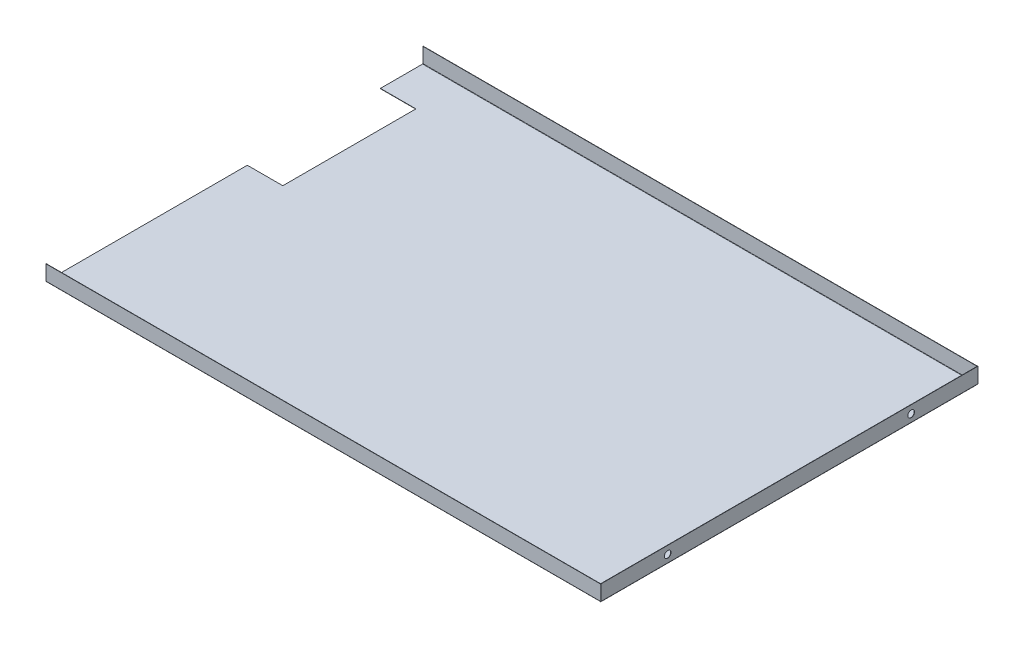
ISO-10303-21;
HEADER;
FILE_DESCRIPTION(('STEP AP214'),'2;1');
FILE_NAME('part.step','',(''),(''),'','','');
FILE_SCHEMA(('AUTOMOTIVE_DESIGN { 1 0 10303 214 1 1 1 1 }'));
ENDSEC;
DATA;
#1=APPLICATION_CONTEXT('core data for automotive mechanical design processes');
#2=APPLICATION_PROTOCOL_DEFINITION('international standard','automotive_design',2000,#1);
#3=PRODUCT_CONTEXT('',#1,'mechanical');
#4=PRODUCT('Part','Part','',(#3));
#5=PRODUCT_RELATED_PRODUCT_CATEGORY('part','',(#4));
#6=PRODUCT_DEFINITION_FORMATION('','',#4);
#7=PRODUCT_DEFINITION_CONTEXT('part definition',#1,'design');
#8=PRODUCT_DEFINITION('design','',#6,#7);
#9=PRODUCT_DEFINITION_SHAPE('','',#8);
#10=(LENGTH_UNIT() NAMED_UNIT(*) SI_UNIT(.MILLI.,.METRE.));
#11=(NAMED_UNIT(*) PLANE_ANGLE_UNIT() SI_UNIT($,.RADIAN.));
#12=(NAMED_UNIT(*) SI_UNIT($,.STERADIAN.) SOLID_ANGLE_UNIT());
#13=UNCERTAINTY_MEASURE_WITH_UNIT(LENGTH_MEASURE(1.E-05),#10,'distance_accuracy_value','');
#14=(GEOMETRIC_REPRESENTATION_CONTEXT(3) GLOBAL_UNCERTAINTY_ASSIGNED_CONTEXT((#13)) GLOBAL_UNIT_ASSIGNED_CONTEXT((#10,
#11,#12)) REPRESENTATION_CONTEXT('',''));
#15=CARTESIAN_POINT('',(0.,0.,0.));
#16=DIRECTION('',(0.,0.,1.));
#17=DIRECTION('',(1.,0.,0.));
#18=AXIS2_PLACEMENT_3D('',#15,#16,#17);
#19=CARTESIAN_POINT('',(0.,-0.127,170.));
#20=DIRECTION('',(-1.,0.,0.));
#21=DIRECTION('',(0.,0.,1.));
#22=AXIS2_PLACEMENT_3D('',#19,#20,#21);
#23=PLANE('',#22);
#24=DIRECTION('',(0.,-1.,0.));
#25=VECTOR('',#24,1.);
#26=CARTESIAN_POINT('',(0.,-0.127,19.254));
#27=LINE('',#26,#25);
#28=CARTESIAN_POINT('',(0.,0.,19.254));
#29=VERTEX_POINT('',#28);
#30=CARTESIAN_POINT('',(0.,-0.127,19.254));
#31=VERTEX_POINT('',#30);
#32=EDGE_CURVE('E84',#29,#31,#27,.T.);
#33=ORIENTED_EDGE('',*,*,#32,.F.);
#34=DIRECTION('',(0.,0.,-1.));
#35=VECTOR('',#34,1.);
#36=CARTESIAN_POINT('',(0.,0.,170.));
#37=LINE('',#36,#35);
#38=CARTESIAN_POINT('',(0.,0.,0.254));
#39=VERTEX_POINT('',#38);
#40=EDGE_CURVE('E257',#29,#39,#37,.T.);
#41=ORIENTED_EDGE('',*,*,#40,.T.);
#42=DIRECTION('',(0.,-1.,0.));
#43=VECTOR('',#42,1.);
#44=CARTESIAN_POINT('',(0.,0.,0.254));
#45=LINE('',#44,#43);
#46=CARTESIAN_POINT('',(0.,-0.127,0.254));
#47=VERTEX_POINT('',#46);
#48=EDGE_CURVE('E298',#39,#47,#45,.T.);
#49=ORIENTED_EDGE('',*,*,#48,.T.);
#50=DIRECTION('',(0.,0.,-1.));
#51=VECTOR('',#50,1.);
#52=CARTESIAN_POINT('',(0.,-0.127,170.));
#53=LINE('',#52,#51);
#54=EDGE_CURVE('E293',#31,#47,#53,.T.);
#55=ORIENTED_EDGE('',*,*,#54,.F.);
#56=EDGE_LOOP('',(#33,#41,#49,#55));
#57=FACE_BOUND('',#56,.T.);
#58=ADVANCED_FACE('F76',(#57),#23,.T.);
#59=CARTESIAN_POINT('',(249.873,0.,170.));
#60=DIRECTION('',(-1.,0.,0.));
#61=DIRECTION('',(0.,0.,1.));
#62=AXIS2_PLACEMENT_3D('',#59,#60,#61);
#63=PLANE('',#62);
#64=DIRECTION('',(0.,0.,-1.));
#65=VECTOR('',#64,1.);
#66=CARTESIAN_POINT('',(249.873,0.,170.));
#67=LINE('',#66,#65);
#68=CARTESIAN_POINT('',(249.873,0.,170.));
#69=VERTEX_POINT('',#68);
#70=CARTESIAN_POINT('',(249.873,0.,169.965970452561));
#71=VERTEX_POINT('',#70);
#72=EDGE_CURVE('E260',#69,#71,#67,.T.);
#73=ORIENTED_EDGE('',*,*,#72,.T.);
#74=CARTESIAN_POINT('',(249.873,0.126999999999988,169.746));
#75=DIRECTION('',(1.,0.,0.));
#76=DIRECTION('',(0.,0.,-1.));
#77=AXIS2_PLACEMENT_3D('',#74,#75,#76);
#78=CIRCLE('',#77,0.253999999999988);
#79=CARTESIAN_POINT('',(249.873,-0.127,169.746));
#80=VERTEX_POINT('',#79);
#81=EDGE_CURVE('E240',#71,#80,#78,.T.);
#82=ORIENTED_EDGE('',*,*,#81,.T.);
#83=DIRECTION('',(0.,0.,-1.));
#84=VECTOR('',#83,1.);
#85=CARTESIAN_POINT('',(249.873,-0.127,170.));
#86=LINE('',#85,#84);
#87=CARTESIAN_POINT('',(249.873,-0.127,170.));
#88=VERTEX_POINT('',#87);
#89=EDGE_CURVE('E300',#88,#80,#86,.T.);
#90=ORIENTED_EDGE('',*,*,#89,.F.);
#91=DIRECTION('',(0.,1.,0.));
#92=VECTOR('',#91,1.);
#93=CARTESIAN_POINT('',(249.873,-0.127,170.));
#94=LINE('',#93,#92);
#95=EDGE_CURVE('E276',#88,#69,#94,.T.);
#96=ORIENTED_EDGE('',*,*,#95,.T.);
#97=EDGE_LOOP('',(#73,#82,#90,#96));
#98=FACE_BOUND('',#97,.T.);
#99=ADVANCED_FACE('F507',(#98),#63,.T.);
#100=CARTESIAN_POINT('',(249.873,0.,0.254));
#101=DIRECTION('',(-1.,0.,0.));
#102=DIRECTION('',(0.,0.,1.));
#103=AXIS2_PLACEMENT_3D('',#100,#101,#102);
#104=PLANE('',#103);
#105=CARTESIAN_POINT('',(249.873,-0.127,0.254));
#106=VERTEX_POINT('',#105);
#107=CARTESIAN_POINT('',(249.873,-0.127,0.));
#108=VERTEX_POINT('',#107);
#109=EDGE_CURVE('E303',#106,#108,#86,.T.);
#110=ORIENTED_EDGE('',*,*,#109,.F.);
#111=CARTESIAN_POINT('',(249.873,0.126999999999999,0.254));
#112=DIRECTION('',(-1.,0.,0.));
#113=DIRECTION('',(0.,0.,1.));
#114=AXIS2_PLACEMENT_3D('',#111,#112,#113);
#115=CIRCLE('',#114,0.254);
#116=CARTESIAN_POINT('',(249.873,0.,0.0340295474387515));
#117=VERTEX_POINT('',#116);
#118=EDGE_CURVE('E353',#106,#117,#115,.F.);
#119=ORIENTED_EDGE('',*,*,#118,.T.);
#120=DIRECTION('',(0.,0.,-1.));
#121=VECTOR('',#120,1.);
#122=CARTESIAN_POINT('',(249.873,0.,0.254));
#123=LINE('',#122,#121);
#124=CARTESIAN_POINT('',(249.873,0.,0.));
#125=VERTEX_POINT('',#124);
#126=EDGE_CURVE('E351',#117,#125,#123,.T.);
#127=ORIENTED_EDGE('',*,*,#126,.T.);
#128=DIRECTION('',(0.,-1.,0.));
#129=VECTOR('',#128,1.);
#130=CARTESIAN_POINT('',(249.873,0.,0.));
#131=LINE('',#130,#129);
#132=EDGE_CURVE('E274',#125,#108,#131,.T.);
#133=ORIENTED_EDGE('',*,*,#132,.T.);
#134=EDGE_LOOP('',(#110,#119,#127,#133));
#135=FACE_BOUND('',#134,.T.);
#136=ADVANCED_FACE('F512',(#135),#104,.T.);
#137=CARTESIAN_POINT('',(0.,0.,170.));
#138=DIRECTION('',(0.,1.,0.));
#139=DIRECTION('',(0.,0.,1.));
#140=AXIS2_PLACEMENT_3D('',#137,#138,#139);
#141=PLANE('',#140);
#142=DIRECTION('',(-1.,0.,0.));
#143=VECTOR('',#142,1.);
#144=CARTESIAN_POINT('',(0.,0.,19.254));
#145=LINE('',#144,#143);
#146=CARTESIAN_POINT('',(16.,0.,19.254));
#147=VERTEX_POINT('',#146);
#148=EDGE_CURVE('E286',#147,#29,#145,.T.);
#149=ORIENTED_EDGE('',*,*,#148,.F.);
#150=DIRECTION('',(0.,0.,-1.));
#151=VECTOR('',#150,1.);
#152=CARTESIAN_POINT('',(16.,0.,19.254));
#153=LINE('',#152,#151);
#154=CARTESIAN_POINT('',(16.,0.,79.254));
#155=VERTEX_POINT('',#154);
#156=EDGE_CURVE('E250',#155,#147,#153,.T.);
#157=ORIENTED_EDGE('',*,*,#156,.F.);
#158=DIRECTION('',(1.,0.,0.));
#159=VECTOR('',#158,1.);
#160=CARTESIAN_POINT('',(16.,0.,79.254));
#161=LINE('',#160,#159);
#162=CARTESIAN_POINT('',(0.,0.,79.254));
#163=VERTEX_POINT('',#162);
#164=EDGE_CURVE('E234',#163,#155,#161,.T.);
#165=ORIENTED_EDGE('',*,*,#164,.F.);
#166=CARTESIAN_POINT('',(0.,0.,169.746));
#167=VERTEX_POINT('',#166);
#168=EDGE_CURVE('E247',#167,#163,#37,.T.);
#169=ORIENTED_EDGE('',*,*,#168,.F.);
#170=DIRECTION('',(1.,0.,0.));
#171=VECTOR('',#170,1.);
#172=CARTESIAN_POINT('',(249.873,0.,169.746));
#173=LINE('',#172,#171);
#174=CARTESIAN_POINT('',(249.873,0.,169.746));
#175=VERTEX_POINT('',#174);
#176=EDGE_CURVE('E407',#175,#167,#173,.F.);
#177=ORIENTED_EDGE('',*,*,#176,.F.);
#178=CARTESIAN_POINT('',(249.873,0.,0.254));
#179=VERTEX_POINT('',#178);
#180=EDGE_CURVE('E256',#175,#179,#67,.T.);
#181=ORIENTED_EDGE('',*,*,#180,.T.);
#182=DIRECTION('',(-1.,0.,0.));
#183=VECTOR('',#182,1.);
#184=CARTESIAN_POINT('',(0.,0.,0.254));
#185=LINE('',#184,#183);
#186=EDGE_CURVE('E357',#39,#179,#185,.F.);
#187=ORIENTED_EDGE('',*,*,#186,.F.);
#188=ORIENTED_EDGE('',*,*,#40,.F.);
#189=EDGE_LOOP('',(#149,#157,#165,#169,#177,#181,#187,#188));
#190=FACE_BOUND('',#189,.T.);
#191=ADVANCED_FACE('F245',(#190),#141,.T.);
#192=CARTESIAN_POINT('',(0.,-0.127,170.));
#193=DIRECTION('',(0.,1.,0.));
#194=DIRECTION('',(0.,0.,1.));
#195=AXIS2_PLACEMENT_3D('',#192,#193,#194);
#196=PLANE('',#195);
#197=DIRECTION('',(0.,0.,-1.));
#198=VECTOR('',#197,1.);
#199=CARTESIAN_POINT('',(16.,-0.127,170.));
#200=LINE('',#199,#198);
#201=CARTESIAN_POINT('',(16.,-0.127,79.254));
#202=VERTEX_POINT('',#201);
#203=CARTESIAN_POINT('',(16.,-0.127,19.254));
#204=VERTEX_POINT('',#203);
#205=EDGE_CURVE('E13',#202,#204,#200,.T.);
#206=ORIENTED_EDGE('',*,*,#205,.T.);
#207=DIRECTION('',(-1.,0.,0.));
#208=VECTOR('',#207,1.);
#209=CARTESIAN_POINT('',(0.,-0.127,19.254));
#210=LINE('',#209,#208);
#211=EDGE_CURVE('E284',#204,#31,#210,.T.);
#212=ORIENTED_EDGE('',*,*,#211,.T.);
#213=ORIENTED_EDGE('',*,*,#54,.T.);
#214=DIRECTION('',(-1.,0.,0.));
#215=VECTOR('',#214,1.);
#216=CARTESIAN_POINT('',(0.,-0.127000000000001,0.254));
#217=LINE('',#216,#215);
#218=EDGE_CURVE('E367',#47,#106,#217,.F.);
#219=ORIENTED_EDGE('',*,*,#218,.T.);
#220=EDGE_CURVE('E302',#80,#106,#86,.T.);
#221=ORIENTED_EDGE('',*,*,#220,.F.);
#222=DIRECTION('',(1.,0.,0.));
#223=VECTOR('',#222,1.);
#224=CARTESIAN_POINT('',(249.873,-0.127,169.746));
#225=LINE('',#224,#223);
#226=CARTESIAN_POINT('',(0.,-0.127,169.746));
#227=VERTEX_POINT('',#226);
#228=EDGE_CURVE('E416',#80,#227,#225,.F.);
#229=ORIENTED_EDGE('',*,*,#228,.T.);
#230=CARTESIAN_POINT('',(0.,-0.127,79.254));
#231=VERTEX_POINT('',#230);
#232=EDGE_CURVE('E261',#227,#231,#53,.T.);
#233=ORIENTED_EDGE('',*,*,#232,.T.);
#234=DIRECTION('',(1.,0.,0.));
#235=VECTOR('',#234,1.);
#236=CARTESIAN_POINT('',(0.,-0.127,79.254));
#237=LINE('',#236,#235);
#238=EDGE_CURVE('E91',#231,#202,#237,.T.);
#239=ORIENTED_EDGE('',*,*,#238,.T.);
#240=EDGE_LOOP('',(#206,#212,#213,#219,#221,#229,#233,#239));
#241=FACE_BOUND('',#240,.T.);
#242=ADVANCED_FACE('F291',(#241),#196,.F.);
#243=DIRECTION('',(0.,1.,0.));
#244=VECTOR('',#243,1.);
#245=CARTESIAN_POINT('',(0.,-0.127,79.254));
#246=LINE('',#245,#244);
#247=EDGE_CURVE('E231',#231,#163,#246,.T.);
#248=ORIENTED_EDGE('',*,*,#247,.F.);
#249=ORIENTED_EDGE('',*,*,#232,.F.);
#250=DIRECTION('',(0.,-1.,0.));
#251=VECTOR('',#250,1.);
#252=CARTESIAN_POINT('',(0.,0.,169.746));
#253=LINE('',#252,#251);
#254=EDGE_CURVE('E255',#167,#227,#253,.T.);
#255=ORIENTED_EDGE('',*,*,#254,.F.);
#256=ORIENTED_EDGE('',*,*,#168,.T.);
#257=EDGE_LOOP('',(#248,#249,#255,#256));
#258=FACE_BOUND('',#257,.T.);
#259=ADVANCED_FACE('F253',(#258),#23,.T.);
#260=CARTESIAN_POINT('',(250.,0.127,170.));
#261=DIRECTION('',(0.,0.,1.));
#262=DIRECTION('',(1.,0.,0.));
#263=AXIS2_PLACEMENT_3D('',#260,#261,#262);
#264=PLANE('',#263);
#265=DIRECTION('',(1.,0.,0.));
#266=VECTOR('',#265,1.);
#267=CARTESIAN_POINT('',(250.,0.127,170.));
#268=LINE('',#267,#266);
#269=CARTESIAN_POINT('',(250.,0.127,170.));
#270=VERTEX_POINT('',#269);
#271=CARTESIAN_POINT('',(250.127,0.127,170.));
#272=VERTEX_POINT('',#271);
#273=EDGE_CURVE('E279',#270,#272,#268,.T.);
#274=ORIENTED_EDGE('',*,*,#273,.F.);
#275=CARTESIAN_POINT('',(249.873,0.127,170.));
#276=DIRECTION('',(0.,0.,-1.));
#277=DIRECTION('',(-1.,0.,0.));
#278=AXIS2_PLACEMENT_3D('',#275,#276,#277);
#279=CIRCLE('',#278,0.127);
#280=EDGE_CURVE('E322',#69,#270,#279,.F.);
#281=ORIENTED_EDGE('',*,*,#280,.F.);
#282=ORIENTED_EDGE('',*,*,#95,.F.);
#283=CARTESIAN_POINT('',(249.873,0.127,170.));
#284=DIRECTION('',(0.,0.,1.));
#285=DIRECTION('',(1.,0.,0.));
#286=AXIS2_PLACEMENT_3D('',#283,#284,#285);
#287=CIRCLE('',#286,0.254);
#288=EDGE_CURVE('E315',#88,#272,#287,.T.);
#289=ORIENTED_EDGE('',*,*,#288,.T.);
#290=EDGE_LOOP('',(#274,#281,#282,#289));
#291=FACE_BOUND('',#290,.T.);
#292=ADVANCED_FACE('F78',(#291),#264,.T.);
#293=CARTESIAN_POINT('',(249.873,-0.127,170.));
#294=DIRECTION('',(0.,0.,1.));
#295=DIRECTION('',(1.,0.,0.));
#296=AXIS2_PLACEMENT_3D('',#293,#294,#295);
#297=PLANE('',#296);
#298=DIRECTION('',(0.,1.,0.));
#299=VECTOR('',#298,1.);
#300=CARTESIAN_POINT('',(250.,0.,170.));
#301=LINE('',#300,#299);
#302=CARTESIAN_POINT('',(250.,7.,170.));
#303=VERTEX_POINT('',#302);
#304=EDGE_CURVE('E342',#270,#303,#301,.T.);
#305=ORIENTED_EDGE('',*,*,#304,.F.);
#306=ORIENTED_EDGE('',*,*,#273,.T.);
#307=DIRECTION('',(0.,1.,0.));
#308=VECTOR('',#307,1.);
#309=CARTESIAN_POINT('',(250.127,0.,170.));
#310=LINE('',#309,#308);
#311=CARTESIAN_POINT('',(250.127,7.,170.));
#312=VERTEX_POINT('',#311);
#313=EDGE_CURVE('E327',#272,#312,#310,.T.);
#314=ORIENTED_EDGE('',*,*,#313,.T.);
#315=DIRECTION('',(1.,0.,0.));
#316=VECTOR('',#315,1.);
#317=CARTESIAN_POINT('',(250.,7.,170.));
#318=LINE('',#317,#316);
#319=EDGE_CURVE('E345',#303,#312,#318,.T.);
#320=ORIENTED_EDGE('',*,*,#319,.F.);
#321=EDGE_LOOP('',(#305,#306,#314,#320));
#322=FACE_BOUND('',#321,.T.);
#323=ADVANCED_FACE('F490',(#322),#297,.T.);
#324=CARTESIAN_POINT('',(249.873,0.,0.));
#325=DIRECTION('',(0.,0.,-1.));
#326=DIRECTION('',(-1.,0.,0.));
#327=AXIS2_PLACEMENT_3D('',#324,#325,#326);
#328=PLANE('',#327);
#329=ORIENTED_EDGE('',*,*,#132,.F.);
#330=CARTESIAN_POINT('',(249.873,0.127,0.));
#331=DIRECTION('',(0.,0.,-1.));
#332=DIRECTION('',(-1.,0.,0.));
#333=AXIS2_PLACEMENT_3D('',#330,#331,#332);
#334=CIRCLE('',#333,0.127);
#335=CARTESIAN_POINT('',(250.,0.127,0.));
#336=VERTEX_POINT('',#335);
#337=EDGE_CURVE('E328',#125,#336,#334,.F.);
#338=ORIENTED_EDGE('',*,*,#337,.T.);
#339=DIRECTION('',(-1.,0.,0.));
#340=VECTOR('',#339,1.);
#341=CARTESIAN_POINT('',(250.127,0.127,0.));
#342=LINE('',#341,#340);
#343=CARTESIAN_POINT('',(250.127,0.127,0.));
#344=VERTEX_POINT('',#343);
#345=EDGE_CURVE('E272',#344,#336,#342,.T.);
#346=ORIENTED_EDGE('',*,*,#345,.F.);
#347=CARTESIAN_POINT('',(249.873,0.127,0.));
#348=DIRECTION('',(0.,0.,1.));
#349=DIRECTION('',(1.,0.,0.));
#350=AXIS2_PLACEMENT_3D('',#347,#348,#349);
#351=CIRCLE('',#350,0.254);
#352=EDGE_CURVE('E325',#108,#344,#351,.T.);
#353=ORIENTED_EDGE('',*,*,#352,.F.);
#354=EDGE_LOOP('',(#329,#338,#346,#353));
#355=FACE_BOUND('',#354,.T.);
#356=ADVANCED_FACE('F486',(#355),#328,.T.);
#357=CARTESIAN_POINT('',(250.127,0.,170.));
#358=DIRECTION('',(-1.,0.,0.));
#359=DIRECTION('',(0.,0.,1.));
#360=AXIS2_PLACEMENT_3D('',#357,#358,#359);
#361=PLANE('',#360);
#362=CARTESIAN_POINT('',(250.127,3.45117189676535,139.873));
#363=DIRECTION('',(-1.,0.,0.));
#364=DIRECTION('',(0.,0.,1.));
#365=AXIS2_PLACEMENT_3D('',#362,#363,#364);
#366=CIRCLE('',#365,1.5);
#367=CARTESIAN_POINT('',(250.127,3.45117189676535,141.373));
#368=VERTEX_POINT('',#367);
#369=EDGE_CURVE('E460',#368,#368,#366,.T.);
#370=ORIENTED_EDGE('',*,*,#369,.T.);
#371=EDGE_LOOP('',(#370));
#372=FACE_BOUND('',#371,.T.);
#373=CARTESIAN_POINT('',(250.127,3.45117189676535,30.127));
#374=DIRECTION('',(-1.,0.,0.));
#375=DIRECTION('',(0.,0.,1.));
#376=AXIS2_PLACEMENT_3D('',#373,#374,#375);
#377=CIRCLE('',#376,1.5);
#378=CARTESIAN_POINT('',(250.127,3.45117189676535,31.627));
#379=VERTEX_POINT('',#378);
#380=EDGE_CURVE('E251',#379,#379,#377,.T.);
#381=ORIENTED_EDGE('',*,*,#380,.T.);
#382=EDGE_LOOP('',(#381));
#383=FACE_BOUND('',#382,.T.);
#384=DIRECTION('',(0.,1.,0.));
#385=VECTOR('',#384,1.);
#386=CARTESIAN_POINT('',(250.127,0.,0.));
#387=LINE('',#386,#385);
#388=CARTESIAN_POINT('',(250.127,7.,0.));
#389=VERTEX_POINT('',#388);
#390=EDGE_CURVE('E337',#344,#389,#387,.T.);
#391=ORIENTED_EDGE('',*,*,#390,.T.);
#392=DIRECTION('',(0.,0.,-1.));
#393=VECTOR('',#392,1.);
#394=CARTESIAN_POINT('',(250.127,7.,170.));
#395=LINE('',#394,#393);
#396=EDGE_CURVE('E270',#312,#389,#395,.T.);
#397=ORIENTED_EDGE('',*,*,#396,.F.);
#398=ORIENTED_EDGE('',*,*,#313,.F.);
#399=DIRECTION('',(0.,0.,-1.));
#400=VECTOR('',#399,1.);
#401=CARTESIAN_POINT('',(250.127,0.127,170.));
#402=LINE('',#401,#400);
#403=EDGE_CURVE('E310',#272,#344,#402,.T.);
#404=ORIENTED_EDGE('',*,*,#403,.T.);
#405=EDGE_LOOP('',(#391,#397,#398,#404));
#406=FACE_BOUND('',#405,.T.);
#407=ADVANCED_FACE('F495',(#372,#383,#406),#361,.F.);
#408=CARTESIAN_POINT('',(250.,7.,170.));
#409=DIRECTION('',(0.,1.,0.));
#410=DIRECTION('',(0.,0.,1.));
#411=AXIS2_PLACEMENT_3D('',#408,#409,#410);
#412=PLANE('',#411);
#413=DIRECTION('',(1.,0.,0.));
#414=VECTOR('',#413,1.);
#415=CARTESIAN_POINT('',(250.,7.,0.));
#416=LINE('',#415,#414);
#417=CARTESIAN_POINT('',(250.,7.,0.));
#418=VERTEX_POINT('',#417);
#419=EDGE_CURVE('E334',#418,#389,#416,.T.);
#420=ORIENTED_EDGE('',*,*,#419,.F.);
#421=DIRECTION('',(0.,0.,-1.));
#422=VECTOR('',#421,1.);
#423=CARTESIAN_POINT('',(250.,7.,170.));
#424=LINE('',#423,#422);
#425=EDGE_CURVE('E268',#303,#418,#424,.T.);
#426=ORIENTED_EDGE('',*,*,#425,.F.);
#427=ORIENTED_EDGE('',*,*,#319,.T.);
#428=ORIENTED_EDGE('',*,*,#396,.T.);
#429=EDGE_LOOP('',(#420,#426,#427,#428));
#430=FACE_BOUND('',#429,.T.);
#431=ADVANCED_FACE('F474',(#430),#412,.T.);
#432=CARTESIAN_POINT('',(250.,0.,170.));
#433=DIRECTION('',(-1.,0.,0.));
#434=DIRECTION('',(0.,0.,1.));
#435=AXIS2_PLACEMENT_3D('',#432,#433,#434);
#436=PLANE('',#435);
#437=CARTESIAN_POINT('',(250.,3.45117189676535,139.873));
#438=DIRECTION('',(-1.,0.,0.));
#439=DIRECTION('',(0.,0.,1.));
#440=AXIS2_PLACEMENT_3D('',#437,#438,#439);
#441=CIRCLE('',#440,1.5);
#442=CARTESIAN_POINT('',(250.,3.45117189676535,141.373));
#443=VERTEX_POINT('',#442);
#444=EDGE_CURVE('E463',#443,#443,#441,.T.);
#445=ORIENTED_EDGE('',*,*,#444,.F.);
#446=EDGE_LOOP('',(#445));
#447=FACE_BOUND('',#446,.T.);
#448=CARTESIAN_POINT('',(250.,3.45117189676535,30.127));
#449=DIRECTION('',(-1.,0.,0.));
#450=DIRECTION('',(0.,0.,1.));
#451=AXIS2_PLACEMENT_3D('',#448,#449,#450);
#452=CIRCLE('',#451,1.5);
#453=CARTESIAN_POINT('',(250.,3.45117189676535,31.627));
#454=VERTEX_POINT('',#453);
#455=EDGE_CURVE('E457',#454,#454,#452,.T.);
#456=ORIENTED_EDGE('',*,*,#455,.F.);
#457=EDGE_LOOP('',(#456));
#458=FACE_BOUND('',#457,.T.);
#459=DIRECTION('',(0.,1.,0.));
#460=VECTOR('',#459,1.);
#461=CARTESIAN_POINT('',(250.,0.,0.));
#462=LINE('',#461,#460);
#463=EDGE_CURVE('E331',#336,#418,#462,.T.);
#464=ORIENTED_EDGE('',*,*,#463,.F.);
#465=DIRECTION('',(0.,0.,-1.));
#466=VECTOR('',#465,1.);
#467=CARTESIAN_POINT('',(250.,0.127,170.));
#468=LINE('',#467,#466);
#469=EDGE_CURVE('E265',#270,#336,#468,.T.);
#470=ORIENTED_EDGE('',*,*,#469,.F.);
#471=ORIENTED_EDGE('',*,*,#304,.T.);
#472=ORIENTED_EDGE('',*,*,#425,.T.);
#473=EDGE_LOOP('',(#464,#470,#471,#472));
#474=FACE_BOUND('',#473,.T.);
#475=ADVANCED_FACE('F470',(#447,#458,#474),#436,.T.);
#476=CARTESIAN_POINT('',(249.873,0.127,170.));
#477=DIRECTION('',(0.,0.,-1.));
#478=DIRECTION('',(-1.,0.,0.));
#479=AXIS2_PLACEMENT_3D('',#476,#477,#478);
#480=CYLINDRICAL_SURFACE('',#479,0.127);
#481=ORIENTED_EDGE('',*,*,#337,.F.);
#482=ORIENTED_EDGE('',*,*,#126,.F.);
#483=EDGE_CURVE('E338',#179,#117,#123,.T.);
#484=ORIENTED_EDGE('',*,*,#483,.F.);
#485=ORIENTED_EDGE('',*,*,#180,.F.);
#486=EDGE_CURVE('E99',#71,#175,#67,.T.);
#487=ORIENTED_EDGE('',*,*,#486,.F.);
#488=ORIENTED_EDGE('',*,*,#72,.F.);
#489=ORIENTED_EDGE('',*,*,#280,.T.);
#490=ORIENTED_EDGE('',*,*,#469,.T.);
#491=EDGE_LOOP('',(#481,#482,#484,#485,#487,#488,#489,#490));
#492=FACE_BOUND('',#491,.T.);
#493=ADVANCED_FACE('F473',(#492),#480,.F.);
#494=CARTESIAN_POINT('',(249.873,0.127,170.));
#495=DIRECTION('',(0.,0.,-1.));
#496=DIRECTION('',(-1.,0.,0.));
#497=AXIS2_PLACEMENT_3D('',#494,#495,#496);
#498=CYLINDRICAL_SURFACE('',#497,0.254);
#499=ORIENTED_EDGE('',*,*,#352,.T.);
#500=ORIENTED_EDGE('',*,*,#403,.F.);
#501=ORIENTED_EDGE('',*,*,#288,.F.);
#502=ORIENTED_EDGE('',*,*,#89,.T.);
#503=ORIENTED_EDGE('',*,*,#220,.T.);
#504=ORIENTED_EDGE('',*,*,#109,.T.);
#505=EDGE_LOOP('',(#499,#500,#501,#502,#503,#504));
#506=FACE_BOUND('',#505,.T.);
#507=ADVANCED_FACE('F526',(#506),#498,.T.);
#508=CARTESIAN_POINT('',(249.873,0.127,0.));
#509=DIRECTION('',(0.,0.,-1.));
#510=DIRECTION('',(-1.,0.,0.));
#511=AXIS2_PLACEMENT_3D('',#508,#509,#510);
#512=PLANE('',#511);
#513=ORIENTED_EDGE('',*,*,#390,.F.);
#514=ORIENTED_EDGE('',*,*,#345,.T.);
#515=ORIENTED_EDGE('',*,*,#463,.T.);
#516=ORIENTED_EDGE('',*,*,#419,.T.);
#517=EDGE_LOOP('',(#513,#514,#515,#516));
#518=FACE_BOUND('',#517,.T.);
#519=ADVANCED_FACE('F494',(#518),#512,.T.);
#520=CARTESIAN_POINT('',(249.873,0.126999999999999,0.254));
#521=DIRECTION('',(1.,0.,0.));
#522=DIRECTION('',(0.,0.,-1.));
#523=AXIS2_PLACEMENT_3D('',#520,#521,#522);
#524=PLANE('',#523);
#525=CARTESIAN_POINT('',(249.873,0.126999999999999,0.254));
#526=DIRECTION('',(-1.,0.,0.));
#527=DIRECTION('',(0.,0.,1.));
#528=AXIS2_PLACEMENT_3D('',#525,#526,#527);
#529=CIRCLE('',#528,0.127);
#530=CARTESIAN_POINT('',(249.873,0.126999999999998,0.127));
#531=VERTEX_POINT('',#530);
#532=EDGE_CURVE('E361',#179,#531,#529,.F.);
#533=ORIENTED_EDGE('',*,*,#532,.F.);
#534=ORIENTED_EDGE('',*,*,#483,.T.);
#535=CARTESIAN_POINT('',(249.873,0.126999999999998,0.));
#536=VERTEX_POINT('',#535);
#537=EDGE_CURVE('E370',#117,#536,#115,.F.);
#538=ORIENTED_EDGE('',*,*,#537,.T.);
#539=DIRECTION('',(0.,0.,1.));
#540=VECTOR('',#539,1.);
#541=CARTESIAN_POINT('',(249.873,0.127,0.));
#542=LINE('',#541,#540);
#543=EDGE_CURVE('E372',#531,#536,#542,.F.);
#544=ORIENTED_EDGE('',*,*,#543,.F.);
#545=EDGE_LOOP('',(#533,#534,#538,#544));
#546=FACE_BOUND('',#545,.T.);
#547=ADVANCED_FACE('F531',(#546),#524,.T.);
#548=CARTESIAN_POINT('',(0.,0.126999999999999,0.254));
#549=DIRECTION('',(1.,0.,0.));
#550=DIRECTION('',(0.,0.,-1.));
#551=AXIS2_PLACEMENT_3D('',#548,#549,#550);
#552=PLANE('',#551);
#553=CARTESIAN_POINT('',(0.,0.126999999999999,0.254));
#554=DIRECTION('',(-1.,0.,0.));
#555=DIRECTION('',(0.,0.,1.));
#556=AXIS2_PLACEMENT_3D('',#553,#554,#555);
#557=CIRCLE('',#556,0.127);
#558=CARTESIAN_POINT('',(0.,0.126999999999998,0.127));
#559=VERTEX_POINT('',#558);
#560=EDGE_CURVE('E354',#559,#39,#557,.T.);
#561=ORIENTED_EDGE('',*,*,#560,.F.);
#562=DIRECTION('',(0.,0.,1.));
#563=VECTOR('',#562,1.);
#564=CARTESIAN_POINT('',(0.,0.127,0.127));
#565=LINE('',#564,#563);
#566=CARTESIAN_POINT('',(0.,0.127,0.));
#567=VERTEX_POINT('',#566);
#568=EDGE_CURVE('E377',#559,#567,#565,.F.);
#569=ORIENTED_EDGE('',*,*,#568,.T.);
#570=CARTESIAN_POINT('',(0.,0.126999999999999,0.254));
#571=DIRECTION('',(-1.,0.,0.));
#572=DIRECTION('',(0.,0.,1.));
#573=AXIS2_PLACEMENT_3D('',#570,#571,#572);
#574=CIRCLE('',#573,0.254);
#575=EDGE_CURVE('E364',#567,#47,#574,.T.);
#576=ORIENTED_EDGE('',*,*,#575,.T.);
#577=ORIENTED_EDGE('',*,*,#48,.F.);
#578=EDGE_LOOP('',(#561,#569,#576,#577));
#579=FACE_BOUND('',#578,.T.);
#580=ADVANCED_FACE('F535',(#579),#552,.F.);
#581=CARTESIAN_POINT('',(0.,0.126999999999999,0.254));
#582=DIRECTION('',(-1.,0.,0.));
#583=DIRECTION('',(0.,0.,-1.));
#584=AXIS2_PLACEMENT_3D('',#581,#582,#583);
#585=CYLINDRICAL_SURFACE('',#584,0.254);
#586=ORIENTED_EDGE('',*,*,#218,.F.);
#587=ORIENTED_EDGE('',*,*,#575,.F.);
#588=DIRECTION('',(-1.,0.,0.));
#589=VECTOR('',#588,1.);
#590=CARTESIAN_POINT('',(249.873,0.127,0.));
#591=LINE('',#590,#589);
#592=EDGE_CURVE('E380',#567,#536,#591,.F.);
#593=ORIENTED_EDGE('',*,*,#592,.T.);
#594=ORIENTED_EDGE('',*,*,#537,.F.);
#595=ORIENTED_EDGE('',*,*,#118,.F.);
#596=EDGE_LOOP('',(#586,#587,#593,#594,#595));
#597=FACE_BOUND('',#596,.T.);
#598=ADVANCED_FACE('F538',(#597),#585,.T.);
#599=CARTESIAN_POINT('',(0.,0.126999999999999,0.254));
#600=DIRECTION('',(-1.,0.,0.));
#601=DIRECTION('',(0.,0.,-1.));
#602=AXIS2_PLACEMENT_3D('',#599,#600,#601);
#603=CYLINDRICAL_SURFACE('',#602,0.127);
#604=ORIENTED_EDGE('',*,*,#186,.T.);
#605=ORIENTED_EDGE('',*,*,#532,.T.);
#606=DIRECTION('',(-1.,0.,0.));
#607=VECTOR('',#606,1.);
#608=CARTESIAN_POINT('',(249.873,0.127,0.127));
#609=LINE('',#608,#607);
#610=EDGE_CURVE('E375',#531,#559,#609,.T.);
#611=ORIENTED_EDGE('',*,*,#610,.T.);
#612=ORIENTED_EDGE('',*,*,#560,.T.);
#613=EDGE_LOOP('',(#604,#605,#611,#612));
#614=FACE_BOUND('',#613,.T.);
#615=ADVANCED_FACE('F543',(#614),#603,.F.);
#616=CARTESIAN_POINT('',(0.,6.873,0.));
#617=DIRECTION('',(1.,0.,0.));
#618=DIRECTION('',(0.,0.,-1.));
#619=AXIS2_PLACEMENT_3D('',#616,#617,#618);
#620=PLANE('',#619);
#621=ORIENTED_EDGE('',*,*,#568,.F.);
#622=DIRECTION('',(0.,-1.,0.));
#623=VECTOR('',#622,1.);
#624=CARTESIAN_POINT('',(0.,6.873,0.126999999999976));
#625=LINE('',#624,#623);
#626=CARTESIAN_POINT('',(0.,6.873,0.126999999999976));
#627=VERTEX_POINT('',#626);
#628=EDGE_CURVE('E383',#559,#627,#625,.F.);
#629=ORIENTED_EDGE('',*,*,#628,.T.);
#630=DIRECTION('',(0.,0.,1.));
#631=VECTOR('',#630,1.);
#632=CARTESIAN_POINT('',(0.,6.873,0.));
#633=LINE('',#632,#631);
#634=CARTESIAN_POINT('',(0.,6.873,0.));
#635=VERTEX_POINT('',#634);
#636=EDGE_CURVE('E358',#635,#627,#633,.T.);
#637=ORIENTED_EDGE('',*,*,#636,.F.);
#638=DIRECTION('',(0.,1.,0.));
#639=VECTOR('',#638,1.);
#640=CARTESIAN_POINT('',(0.,0.,0.));
#641=LINE('',#640,#639);
#642=EDGE_CURVE('E390',#567,#635,#641,.T.);
#643=ORIENTED_EDGE('',*,*,#642,.F.);
#644=EDGE_LOOP('',(#621,#629,#637,#643));
#645=FACE_BOUND('',#644,.T.);
#646=ADVANCED_FACE('F546',(#645),#620,.F.);
#647=CARTESIAN_POINT('',(249.873,0.,0.));
#648=DIRECTION('',(-1.,0.,0.));
#649=DIRECTION('',(0.,0.,1.));
#650=AXIS2_PLACEMENT_3D('',#647,#648,#649);
#651=PLANE('',#650);
#652=ORIENTED_EDGE('',*,*,#543,.T.);
#653=DIRECTION('',(0.,-1.,0.));
#654=VECTOR('',#653,1.);
#655=CARTESIAN_POINT('',(249.873,0.,0.));
#656=LINE('',#655,#654);
#657=CARTESIAN_POINT('',(249.873,6.873,0.));
#658=VERTEX_POINT('',#657);
#659=EDGE_CURVE('E394',#658,#536,#656,.T.);
#660=ORIENTED_EDGE('',*,*,#659,.F.);
#661=DIRECTION('',(0.,0.,1.));
#662=VECTOR('',#661,1.);
#663=CARTESIAN_POINT('',(249.873,6.873,0.));
#664=LINE('',#663,#662);
#665=CARTESIAN_POINT('',(249.873,6.873,0.126999999999976));
#666=VERTEX_POINT('',#665);
#667=EDGE_CURVE('E397',#658,#666,#664,.T.);
#668=ORIENTED_EDGE('',*,*,#667,.T.);
#669=DIRECTION('',(0.,1.,0.));
#670=VECTOR('',#669,1.);
#671=CARTESIAN_POINT('',(249.873,0.,0.127));
#672=LINE('',#671,#670);
#673=EDGE_CURVE('E387',#666,#531,#672,.F.);
#674=ORIENTED_EDGE('',*,*,#673,.T.);
#675=EDGE_LOOP('',(#652,#660,#668,#674));
#676=FACE_BOUND('',#675,.T.);
#677=ADVANCED_FACE('F553',(#676),#651,.F.);
#678=CARTESIAN_POINT('',(0.,0.,0.));
#679=DIRECTION('',(0.,0.,1.));
#680=DIRECTION('',(0.,-1.,0.));
#681=AXIS2_PLACEMENT_3D('',#678,#679,#680);
#682=PLANE('',#681);
#683=ORIENTED_EDGE('',*,*,#592,.F.);
#684=ORIENTED_EDGE('',*,*,#642,.T.);
#685=DIRECTION('',(1.,0.,0.));
#686=VECTOR('',#685,1.);
#687=CARTESIAN_POINT('',(0.,6.873,0.));
#688=LINE('',#687,#686);
#689=EDGE_CURVE('E392',#635,#658,#688,.T.);
#690=ORIENTED_EDGE('',*,*,#689,.T.);
#691=ORIENTED_EDGE('',*,*,#659,.T.);
#692=EDGE_LOOP('',(#683,#684,#690,#691));
#693=FACE_BOUND('',#692,.T.);
#694=ADVANCED_FACE('F563',(#693),#682,.F.);
#695=CARTESIAN_POINT('',(0.,0.,0.127));
#696=DIRECTION('',(0.,0.,1.));
#697=DIRECTION('',(0.,-1.,0.));
#698=AXIS2_PLACEMENT_3D('',#695,#696,#697);
#699=PLANE('',#698);
#700=ORIENTED_EDGE('',*,*,#628,.F.);
#701=ORIENTED_EDGE('',*,*,#610,.F.);
#702=ORIENTED_EDGE('',*,*,#673,.F.);
#703=DIRECTION('',(-1.,0.,0.));
#704=VECTOR('',#703,1.);
#705=CARTESIAN_POINT('',(249.873,6.873,0.126999999999976));
#706=LINE('',#705,#704);
#707=EDGE_CURVE('E385',#627,#666,#706,.F.);
#708=ORIENTED_EDGE('',*,*,#707,.F.);
#709=EDGE_LOOP('',(#700,#701,#702,#708));
#710=FACE_BOUND('',#709,.T.);
#711=ADVANCED_FACE('F559',(#710),#699,.T.);
#712=CARTESIAN_POINT('',(249.873,6.873,0.));
#713=DIRECTION('',(0.,-1.,0.));
#714=DIRECTION('',(0.,0.,-1.));
#715=AXIS2_PLACEMENT_3D('',#712,#713,#714);
#716=PLANE('',#715);
#717=ORIENTED_EDGE('',*,*,#707,.T.);
#718=ORIENTED_EDGE('',*,*,#667,.F.);
#719=ORIENTED_EDGE('',*,*,#689,.F.);
#720=ORIENTED_EDGE('',*,*,#636,.T.);
#721=EDGE_LOOP('',(#717,#718,#719,#720));
#722=FACE_BOUND('',#721,.T.);
#723=ADVANCED_FACE('F555',(#722),#716,.F.);
#724=CARTESIAN_POINT('',(0.,0.126999999999988,169.746));
#725=DIRECTION('',(-1.,0.,0.));
#726=DIRECTION('',(0.,0.,1.));
#727=AXIS2_PLACEMENT_3D('',#724,#725,#726);
#728=PLANE('',#727);
#729=DIRECTION('',(0.,0.,-1.));
#730=VECTOR('',#729,1.);
#731=CARTESIAN_POINT('',(0.,0.126999999999988,170.));
#732=LINE('',#731,#730);
#733=CARTESIAN_POINT('',(0.,0.126999999999988,169.873));
#734=VERTEX_POINT('',#733);
#735=CARTESIAN_POINT('',(0.,0.126999999999988,170.));
#736=VERTEX_POINT('',#735);
#737=EDGE_CURVE('E295',#734,#736,#732,.F.);
#738=ORIENTED_EDGE('',*,*,#737,.F.);
#739=CARTESIAN_POINT('',(0.,0.126999999999988,169.746));
#740=DIRECTION('',(1.,0.,0.));
#741=DIRECTION('',(0.,0.,-1.));
#742=AXIS2_PLACEMENT_3D('',#739,#740,#741);
#743=CIRCLE('',#742,0.126999999999988);
#744=EDGE_CURVE('E410',#167,#734,#743,.F.);
#745=ORIENTED_EDGE('',*,*,#744,.F.);
#746=ORIENTED_EDGE('',*,*,#254,.T.);
#747=CARTESIAN_POINT('',(0.,0.126999999999988,169.746));
#748=DIRECTION('',(1.,0.,0.));
#749=DIRECTION('',(0.,0.,-1.));
#750=AXIS2_PLACEMENT_3D('',#747,#748,#749);
#751=CIRCLE('',#750,0.253999999999988);
#752=EDGE_CURVE('E403',#227,#736,#751,.F.);
#753=ORIENTED_EDGE('',*,*,#752,.T.);
#754=EDGE_LOOP('',(#738,#745,#746,#753));
#755=FACE_BOUND('',#754,.T.);
#756=ADVANCED_FACE('F558',(#755),#728,.T.);
#757=CARTESIAN_POINT('',(249.873,0.126999999999988,169.746));
#758=DIRECTION('',(-1.,0.,0.));
#759=DIRECTION('',(0.,0.,1.));
#760=AXIS2_PLACEMENT_3D('',#757,#758,#759);
#761=PLANE('',#760);
#762=CARTESIAN_POINT('',(249.873,0.126999999999988,170.));
#763=VERTEX_POINT('',#762);
#764=EDGE_CURVE('E413',#763,#71,#78,.T.);
#765=ORIENTED_EDGE('',*,*,#764,.T.);
#766=ORIENTED_EDGE('',*,*,#486,.T.);
#767=CARTESIAN_POINT('',(249.873,0.126999999999988,169.746));
#768=DIRECTION('',(1.,0.,0.));
#769=DIRECTION('',(0.,0.,-1.));
#770=AXIS2_PLACEMENT_3D('',#767,#768,#769);
#771=CIRCLE('',#770,0.126999999999988);
#772=CARTESIAN_POINT('',(249.873,0.126999999999988,169.873));
#773=VERTEX_POINT('',#772);
#774=EDGE_CURVE('E404',#773,#175,#771,.T.);
#775=ORIENTED_EDGE('',*,*,#774,.F.);
#776=DIRECTION('',(0.,0.,-1.));
#777=VECTOR('',#776,1.);
#778=CARTESIAN_POINT('',(249.873,0.126999999999988,169.873));
#779=LINE('',#778,#777);
#780=EDGE_CURVE('E424',#773,#763,#779,.F.);
#781=ORIENTED_EDGE('',*,*,#780,.T.);
#782=EDGE_LOOP('',(#765,#766,#775,#781));
#783=FACE_BOUND('',#782,.T.);
#784=ADVANCED_FACE('F571',(#783),#761,.F.);
#785=CARTESIAN_POINT('',(249.873,0.126999999999988,169.746));
#786=DIRECTION('',(1.,0.,0.));
#787=DIRECTION('',(0.,0.,1.));
#788=AXIS2_PLACEMENT_3D('',#785,#786,#787);
#789=CYLINDRICAL_SURFACE('',#788,0.253999999999988);
#790=ORIENTED_EDGE('',*,*,#228,.F.);
#791=ORIENTED_EDGE('',*,*,#81,.F.);
#792=ORIENTED_EDGE('',*,*,#764,.F.);
#793=DIRECTION('',(1.,0.,0.));
#794=VECTOR('',#793,1.);
#795=CARTESIAN_POINT('',(0.,0.126999999999988,170.));
#796=LINE('',#795,#794);
#797=EDGE_CURVE('E427',#763,#736,#796,.F.);
#798=ORIENTED_EDGE('',*,*,#797,.T.);
#799=ORIENTED_EDGE('',*,*,#752,.F.);
#800=EDGE_LOOP('',(#790,#791,#792,#798,#799));
#801=FACE_BOUND('',#800,.T.);
#802=ADVANCED_FACE('F574',(#801),#789,.T.);
#803=CARTESIAN_POINT('',(249.873,0.126999999999988,169.746));
#804=DIRECTION('',(1.,0.,0.));
#805=DIRECTION('',(0.,0.,1.));
#806=AXIS2_PLACEMENT_3D('',#803,#804,#805);
#807=CYLINDRICAL_SURFACE('',#806,0.126999999999988);
#808=ORIENTED_EDGE('',*,*,#176,.T.);
#809=ORIENTED_EDGE('',*,*,#744,.T.);
#810=DIRECTION('',(1.,0.,0.));
#811=VECTOR('',#810,1.);
#812=CARTESIAN_POINT('',(0.,0.126999999999988,169.873));
#813=LINE('',#812,#811);
#814=EDGE_CURVE('E422',#734,#773,#813,.T.);
#815=ORIENTED_EDGE('',*,*,#814,.T.);
#816=ORIENTED_EDGE('',*,*,#774,.T.);
#817=EDGE_LOOP('',(#808,#809,#815,#816));
#818=FACE_BOUND('',#817,.T.);
#819=ADVANCED_FACE('F579',(#818),#807,.F.);
#820=CARTESIAN_POINT('',(0.,0.,170.));
#821=DIRECTION('',(1.,0.,0.));
#822=DIRECTION('',(0.,0.,-1.));
#823=AXIS2_PLACEMENT_3D('',#820,#821,#822);
#824=PLANE('',#823);
#825=ORIENTED_EDGE('',*,*,#737,.T.);
#826=DIRECTION('',(0.,-1.,0.));
#827=VECTOR('',#826,1.);
#828=CARTESIAN_POINT('',(0.,0.,170.));
#829=LINE('',#828,#827);
#830=CARTESIAN_POINT('',(0.,6.873,170.));
#831=VERTEX_POINT('',#830);
#832=EDGE_CURVE('E436',#831,#736,#829,.T.);
#833=ORIENTED_EDGE('',*,*,#832,.F.);
#834=DIRECTION('',(0.,0.,-1.));
#835=VECTOR('',#834,1.);
#836=CARTESIAN_POINT('',(0.,6.873,170.));
#837=LINE('',#836,#835);
#838=CARTESIAN_POINT('',(0.,6.873,169.873));
#839=VERTEX_POINT('',#838);
#840=EDGE_CURVE('E443',#831,#839,#837,.T.);
#841=ORIENTED_EDGE('',*,*,#840,.T.);
#842=DIRECTION('',(0.,1.,0.));
#843=VECTOR('',#842,1.);
#844=CARTESIAN_POINT('',(0.,0.,169.873));
#845=LINE('',#844,#843);
#846=EDGE_CURVE('E429',#839,#734,#845,.F.);
#847=ORIENTED_EDGE('',*,*,#846,.T.);
#848=EDGE_LOOP('',(#825,#833,#841,#847));
#849=FACE_BOUND('',#848,.T.);
#850=ADVANCED_FACE('F582',(#849),#824,.F.);
#851=CARTESIAN_POINT('',(249.873,6.873,170.));
#852=DIRECTION('',(-1.,0.,0.));
#853=DIRECTION('',(0.,0.,1.));
#854=AXIS2_PLACEMENT_3D('',#851,#852,#853);
#855=PLANE('',#854);
#856=ORIENTED_EDGE('',*,*,#780,.F.);
#857=DIRECTION('',(0.,-1.,0.));
#858=VECTOR('',#857,1.);
#859=CARTESIAN_POINT('',(249.873,6.873,169.873));
#860=LINE('',#859,#858);
#861=CARTESIAN_POINT('',(249.873,6.873,169.873));
#862=VERTEX_POINT('',#861);
#863=EDGE_CURVE('E432',#773,#862,#860,.F.);
#864=ORIENTED_EDGE('',*,*,#863,.T.);
#865=DIRECTION('',(0.,0.,-1.));
#866=VECTOR('',#865,1.);
#867=CARTESIAN_POINT('',(249.873,6.873,170.));
#868=LINE('',#867,#866);
#869=CARTESIAN_POINT('',(249.873,6.873,170.));
#870=VERTEX_POINT('',#869);
#871=EDGE_CURVE('E408',#870,#862,#868,.T.);
#872=ORIENTED_EDGE('',*,*,#871,.F.);
#873=DIRECTION('',(0.,1.,0.));
#874=VECTOR('',#873,1.);
#875=CARTESIAN_POINT('',(249.873,0.,170.));
#876=LINE('',#875,#874);
#877=EDGE_CURVE('E439',#763,#870,#876,.T.);
#878=ORIENTED_EDGE('',*,*,#877,.F.);
#879=EDGE_LOOP('',(#856,#864,#872,#878));
#880=FACE_BOUND('',#879,.T.);
#881=ADVANCED_FACE('F589',(#880),#855,.F.);
#882=CARTESIAN_POINT('',(0.,0.,170.));
#883=DIRECTION('',(0.,0.,-1.));
#884=DIRECTION('',(-1.,0.,0.));
#885=AXIS2_PLACEMENT_3D('',#882,#883,#884);
#886=PLANE('',#885);
#887=ORIENTED_EDGE('',*,*,#797,.F.);
#888=ORIENTED_EDGE('',*,*,#877,.T.);
#889=DIRECTION('',(-1.,0.,0.));
#890=VECTOR('',#889,1.);
#891=CARTESIAN_POINT('',(0.,6.873,170.));
#892=LINE('',#891,#890);
#893=EDGE_CURVE('E441',#870,#831,#892,.T.);
#894=ORIENTED_EDGE('',*,*,#893,.T.);
#895=ORIENTED_EDGE('',*,*,#832,.T.);
#896=EDGE_LOOP('',(#887,#888,#894,#895));
#897=FACE_BOUND('',#896,.T.);
#898=ADVANCED_FACE('F593',(#897),#886,.F.);
#899=CARTESIAN_POINT('',(0.,0.,169.873));
#900=DIRECTION('',(0.,0.,-1.));
#901=DIRECTION('',(-1.,0.,0.));
#902=AXIS2_PLACEMENT_3D('',#899,#900,#901);
#903=PLANE('',#902);
#904=ORIENTED_EDGE('',*,*,#863,.F.);
#905=ORIENTED_EDGE('',*,*,#814,.F.);
#906=ORIENTED_EDGE('',*,*,#846,.F.);
#907=DIRECTION('',(1.,0.,0.));
#908=VECTOR('',#907,1.);
#909=CARTESIAN_POINT('',(0.,6.873,169.873));
#910=LINE('',#909,#908);
#911=EDGE_CURVE('E434',#862,#839,#910,.F.);
#912=ORIENTED_EDGE('',*,*,#911,.F.);
#913=EDGE_LOOP('',(#904,#905,#906,#912));
#914=FACE_BOUND('',#913,.T.);
#915=ADVANCED_FACE('F599',(#914),#903,.T.);
#916=CARTESIAN_POINT('',(0.,6.873,170.));
#917=DIRECTION('',(0.,-1.,0.));
#918=DIRECTION('',(0.,0.,-1.));
#919=AXIS2_PLACEMENT_3D('',#916,#917,#918);
#920=PLANE('',#919);
#921=ORIENTED_EDGE('',*,*,#911,.T.);
#922=ORIENTED_EDGE('',*,*,#840,.F.);
#923=ORIENTED_EDGE('',*,*,#893,.F.);
#924=ORIENTED_EDGE('',*,*,#871,.T.);
#925=EDGE_LOOP('',(#921,#922,#923,#924));
#926=FACE_BOUND('',#925,.T.);
#927=ADVANCED_FACE('F595',(#926),#920,.F.);
#928=CARTESIAN_POINT('',(16.,-10.,19.254));
#929=DIRECTION('',(1.,0.,0.));
#930=DIRECTION('',(0.,0.,-1.));
#931=AXIS2_PLACEMENT_3D('',#928,#929,#930);
#932=PLANE('',#931);
#933=DIRECTION('',(0.,1.,0.));
#934=VECTOR('',#933,1.);
#935=CARTESIAN_POINT('',(16.,-10.,79.254));
#936=LINE('',#935,#934);
#937=EDGE_CURVE('E450',#202,#155,#936,.T.);
#938=ORIENTED_EDGE('',*,*,#937,.T.);
#939=ORIENTED_EDGE('',*,*,#156,.T.);
#940=DIRECTION('',(0.,1.,0.));
#941=VECTOR('',#940,1.);
#942=CARTESIAN_POINT('',(16.,-10.,19.254));
#943=LINE('',#942,#941);
#944=EDGE_CURVE('E449',#204,#147,#943,.T.);
#945=ORIENTED_EDGE('',*,*,#944,.F.);
#946=ORIENTED_EDGE('',*,*,#205,.F.);
#947=EDGE_LOOP('',(#938,#939,#945,#946));
#948=FACE_BOUND('',#947,.T.);
#949=ADVANCED_FACE('F598',(#948),#932,.F.);
#950=CARTESIAN_POINT('',(0.,-10.,19.254));
#951=DIRECTION('',(0.,0.,-1.));
#952=DIRECTION('',(-1.,0.,0.));
#953=AXIS2_PLACEMENT_3D('',#950,#951,#952);
#954=PLANE('',#953);
#955=ORIENTED_EDGE('',*,*,#944,.T.);
#956=ORIENTED_EDGE('',*,*,#148,.T.);
#957=ORIENTED_EDGE('',*,*,#32,.T.);
#958=ORIENTED_EDGE('',*,*,#211,.F.);
#959=EDGE_LOOP('',(#955,#956,#957,#958));
#960=FACE_BOUND('',#959,.T.);
#961=ADVANCED_FACE('F283',(#960),#954,.F.);
#962=CARTESIAN_POINT('',(16.,-10.,79.254));
#963=DIRECTION('',(0.,0.,1.));
#964=DIRECTION('',(1.,0.,0.));
#965=AXIS2_PLACEMENT_3D('',#962,#963,#964);
#966=PLANE('',#965);
#967=ORIENTED_EDGE('',*,*,#247,.T.);
#968=ORIENTED_EDGE('',*,*,#164,.T.);
#969=ORIENTED_EDGE('',*,*,#937,.F.);
#970=ORIENTED_EDGE('',*,*,#238,.F.);
#971=EDGE_LOOP('',(#967,#968,#969,#970));
#972=FACE_BOUND('',#971,.T.);
#973=ADVANCED_FACE('F233',(#972),#966,.F.);
#974=CARTESIAN_POINT('',(260.,3.45117189676535,30.127));
#975=DIRECTION('',(-1.,0.,0.));
#976=DIRECTION('',(0.,0.,1.));
#977=AXIS2_PLACEMENT_3D('',#974,#975,#976);
#978=CYLINDRICAL_SURFACE('',#977,1.5);
#979=ORIENTED_EDGE('',*,*,#455,.T.);
#980=EDGE_LOOP('',(#979));
#981=FACE_BOUND('',#980,.T.);
#982=ORIENTED_EDGE('',*,*,#380,.F.);
#983=EDGE_LOOP('',(#982));
#984=FACE_BOUND('',#983,.T.);
#985=ADVANCED_FACE('F609',(#981,#984),#978,.F.);
#986=CARTESIAN_POINT('',(260.,3.45117189676535,139.873));
#987=DIRECTION('',(-1.,0.,0.));
#988=DIRECTION('',(0.,0.,1.));
#989=AXIS2_PLACEMENT_3D('',#986,#987,#988);
#990=CYLINDRICAL_SURFACE('',#989,1.5);
#991=ORIENTED_EDGE('',*,*,#444,.T.);
#992=EDGE_LOOP('',(#991));
#993=FACE_BOUND('',#992,.T.);
#994=ORIENTED_EDGE('',*,*,#369,.F.);
#995=EDGE_LOOP('',(#994));
#996=FACE_BOUND('',#995,.T.);
#997=ADVANCED_FACE('F467',(#993,#996),#990,.F.);
#998=CLOSED_SHELL('',(#58,#99,#136,#191,#242,#259,#292,#323,#356,#407,#431,#475,#493,#507,#519,
#547,#580,#598,#615,#646,#677,#694,#711,#723,#756,#784,#802,#819,#850,#881,#898,#915,#927,#949,
#961,#973,#985,#997));
#999=MANIFOLD_SOLID_BREP('B2',#998);
#1000=ADVANCED_BREP_SHAPE_REPRESENTATION('',(#18,#999),#14);
#1001=SHAPE_DEFINITION_REPRESENTATION(#9,#1000);
ENDSEC;
END-ISO-10303-21;
